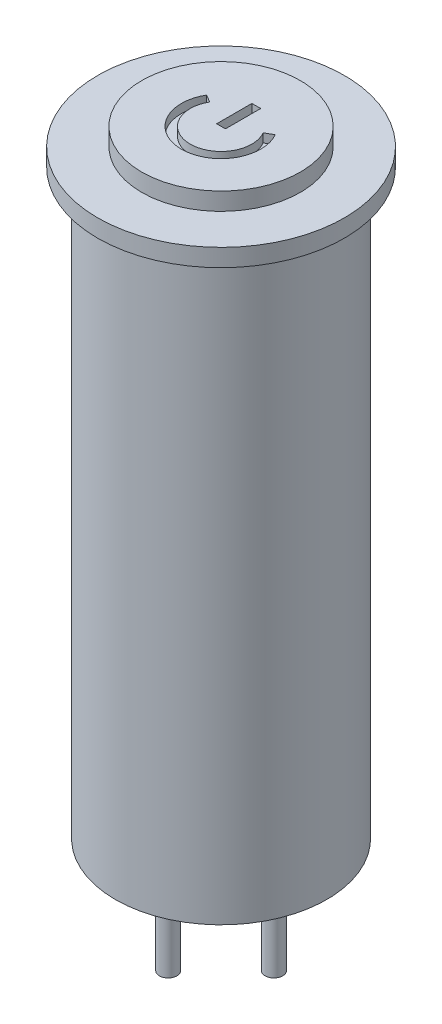
ISO-10303-21;
HEADER;
FILE_DESCRIPTION(('STEP AP214'),'2;1');
FILE_NAME('part.step','',(''),(''),'','','');
FILE_SCHEMA(('AUTOMOTIVE_DESIGN { 1 0 10303 214 1 1 1 1 }'));
ENDSEC;
DATA;
#1=APPLICATION_CONTEXT('core data for automotive mechanical design processes');
#2=APPLICATION_PROTOCOL_DEFINITION('international standard','automotive_design',2000,#1);
#3=PRODUCT_CONTEXT('',#1,'mechanical');
#4=PRODUCT('Part','Part','',(#3));
#5=PRODUCT_RELATED_PRODUCT_CATEGORY('part','',(#4));
#6=PRODUCT_DEFINITION_FORMATION('','',#4);
#7=PRODUCT_DEFINITION_CONTEXT('part definition',#1,'design');
#8=PRODUCT_DEFINITION('design','',#6,#7);
#9=PRODUCT_DEFINITION_SHAPE('','',#8);
#10=(LENGTH_UNIT() NAMED_UNIT(*) SI_UNIT(.MILLI.,.METRE.));
#11=(NAMED_UNIT(*) PLANE_ANGLE_UNIT() SI_UNIT($,.RADIAN.));
#12=(NAMED_UNIT(*) SI_UNIT($,.STERADIAN.) SOLID_ANGLE_UNIT());
#13=UNCERTAINTY_MEASURE_WITH_UNIT(LENGTH_MEASURE(1.E-05),#10,'distance_accuracy_value','');
#14=(GEOMETRIC_REPRESENTATION_CONTEXT(3) GLOBAL_UNCERTAINTY_ASSIGNED_CONTEXT((#13)) GLOBAL_UNIT_ASSIGNED_CONTEXT((#10,
#11,#12)) REPRESENTATION_CONTEXT('',''));
#15=CARTESIAN_POINT('',(0.,0.,0.));
#16=DIRECTION('',(0.,0.,1.));
#17=DIRECTION('',(1.,0.,0.));
#18=AXIS2_PLACEMENT_3D('',#15,#16,#17);
#19=CARTESIAN_POINT('',(0.,1.,0.));
#20=DIRECTION('',(0.,-1.,0.));
#21=DIRECTION('',(0.,0.,-1.));
#22=AXIS2_PLACEMENT_3D('',#19,#20,#21);
#23=CYLINDRICAL_SURFACE('',#22,7.);
#24=CARTESIAN_POINT('',(0.,1.,0.));
#25=DIRECTION('',(0.,1.,0.));
#26=DIRECTION('',(0.,0.,1.));
#27=AXIS2_PLACEMENT_3D('',#24,#25,#26);
#28=CIRCLE('',#27,7.);
#29=CARTESIAN_POINT('',(0.,1.,7.));
#30=VERTEX_POINT('',#29);
#31=EDGE_CURVE('E231',#30,#30,#28,.T.);
#32=ORIENTED_EDGE('',*,*,#31,.F.);
#33=EDGE_LOOP('',(#32));
#34=FACE_BOUND('',#33,.T.);
#35=CARTESIAN_POINT('',(0.,0.,0.));
#36=DIRECTION('',(0.,1.,0.));
#37=DIRECTION('',(0.,0.,1.));
#38=AXIS2_PLACEMENT_3D('',#35,#36,#37);
#39=CIRCLE('',#38,7.);
#40=CARTESIAN_POINT('',(0.,0.,7.));
#41=VERTEX_POINT('',#40);
#42=EDGE_CURVE('E70',#41,#41,#39,.T.);
#43=ORIENTED_EDGE('',*,*,#42,.T.);
#44=EDGE_LOOP('',(#43));
#45=FACE_BOUND('',#44,.T.);
#46=ADVANCED_FACE('F67',(#34,#45),#23,.T.);
#47=CARTESIAN_POINT('',(0.,1.,0.));
#48=DIRECTION('',(0.,1.,0.));
#49=DIRECTION('',(0.,0.,1.));
#50=AXIS2_PLACEMENT_3D('',#47,#48,#49);
#51=PLANE('',#50);
#52=CARTESIAN_POINT('',(0.,1.,0.));
#53=DIRECTION('',(0.,1.,0.));
#54=DIRECTION('',(0.,0.,1.));
#55=AXIS2_PLACEMENT_3D('',#52,#53,#54);
#56=CIRCLE('',#55,4.5);
#57=CARTESIAN_POINT('',(0.,1.,4.5));
#58=VERTEX_POINT('',#57);
#59=EDGE_CURVE('E76',#58,#58,#56,.T.);
#60=ORIENTED_EDGE('',*,*,#59,.F.);
#61=EDGE_LOOP('',(#60));
#62=FACE_BOUND('',#61,.T.);
#63=ORIENTED_EDGE('',*,*,#31,.T.);
#64=EDGE_LOOP('',(#63));
#65=FACE_BOUND('',#64,.T.);
#66=ADVANCED_FACE('F244',(#62,#65),#51,.T.);
#67=CARTESIAN_POINT('',(0.,0.,0.));
#68=DIRECTION('',(0.,1.,0.));
#69=DIRECTION('',(0.,0.,1.));
#70=AXIS2_PLACEMENT_3D('',#67,#68,#69);
#71=PLANE('',#70);
#72=CARTESIAN_POINT('',(0.,0.,0.));
#73=DIRECTION('',(0.,-1.,0.));
#74=DIRECTION('',(0.,0.,-1.));
#75=AXIS2_PLACEMENT_3D('',#72,#73,#74);
#76=CIRCLE('',#75,6.);
#77=CARTESIAN_POINT('',(0.,0.,-6.));
#78=VERTEX_POINT('',#77);
#79=EDGE_CURVE('E12',#78,#78,#76,.T.);
#80=ORIENTED_EDGE('',*,*,#79,.F.);
#81=EDGE_LOOP('',(#80));
#82=FACE_BOUND('',#81,.T.);
#83=ORIENTED_EDGE('',*,*,#42,.F.);
#84=EDGE_LOOP('',(#83));
#85=FACE_BOUND('',#84,.T.);
#86=ADVANCED_FACE('F241',(#82,#85),#71,.F.);
#87=CARTESIAN_POINT('',(0.,2.,0.));
#88=DIRECTION('',(0.,-1.,0.));
#89=DIRECTION('',(0.,0.,-1.));
#90=AXIS2_PLACEMENT_3D('',#87,#88,#89);
#91=CYLINDRICAL_SURFACE('',#90,4.5);
#92=CARTESIAN_POINT('',(0.,2.,0.));
#93=DIRECTION('',(0.,1.,0.));
#94=DIRECTION('',(0.,0.,1.));
#95=AXIS2_PLACEMENT_3D('',#92,#93,#94);
#96=CIRCLE('',#95,4.5);
#97=CARTESIAN_POINT('',(0.,2.,4.5));
#98=VERTEX_POINT('',#97);
#99=EDGE_CURVE('E217',#98,#98,#96,.T.);
#100=ORIENTED_EDGE('',*,*,#99,.F.);
#101=EDGE_LOOP('',(#100));
#102=FACE_BOUND('',#101,.T.);
#103=ORIENTED_EDGE('',*,*,#59,.T.);
#104=EDGE_LOOP('',(#103));
#105=FACE_BOUND('',#104,.T.);
#106=ADVANCED_FACE('F243',(#102,#105),#91,.T.);
#107=CARTESIAN_POINT('',(0.,2.,0.));
#108=DIRECTION('',(0.,1.,0.));
#109=DIRECTION('',(0.,0.,1.));
#110=AXIS2_PLACEMENT_3D('',#107,#108,#109);
#111=PLANE('',#110);
#112=CARTESIAN_POINT('',(0.,2.,0.));
#113=DIRECTION('',(0.,1.,0.));
#114=DIRECTION('',(1.,0.,0.));
#115=AXIS2_PLACEMENT_3D('',#112,#113,#114);
#116=CIRCLE('',#115,2.25);
#117=CARTESIAN_POINT('',(-1.94855715851499,2.,-1.125));
#118=VERTEX_POINT('',#117);
#119=CARTESIAN_POINT('',(1.94855715851499,2.,-1.125));
#120=VERTEX_POINT('',#119);
#121=EDGE_CURVE('E84',#118,#120,#116,.T.);
#122=ORIENTED_EDGE('',*,*,#121,.F.);
#123=DIRECTION('',(0.866025403784439,0.,0.499999999999999));
#124=VECTOR('',#123,1.);
#125=CARTESIAN_POINT('',(-1.94855715851499,2.,-1.125));
#126=LINE('',#125,#124);
#127=CARTESIAN_POINT('',(-1.51554445662277,2.,-0.874999999999999));
#128=VERTEX_POINT('',#127);
#129=EDGE_CURVE('E157',#118,#128,#126,.T.);
#130=ORIENTED_EDGE('',*,*,#129,.T.);
#131=CARTESIAN_POINT('',(0.,2.,0.));
#132=DIRECTION('',(0.,1.,0.));
#133=DIRECTION('',(1.,0.,0.));
#134=AXIS2_PLACEMENT_3D('',#131,#132,#133);
#135=CIRCLE('',#134,1.75);
#136=CARTESIAN_POINT('',(1.51554445662277,2.,-0.874999999999999));
#137=VERTEX_POINT('',#136);
#138=EDGE_CURVE('E161',#128,#137,#135,.T.);
#139=ORIENTED_EDGE('',*,*,#138,.T.);
#140=DIRECTION('',(0.866025403784439,0.,-0.5));
#141=VECTOR('',#140,1.);
#142=CARTESIAN_POINT('',(1.51554445662277,2.,-0.874999999999999));
#143=LINE('',#142,#141);
#144=EDGE_CURVE('E171',#137,#120,#143,.T.);
#145=ORIENTED_EDGE('',*,*,#144,.T.);
#146=EDGE_LOOP('',(#122,#130,#139,#145));
#147=FACE_BOUND('',#146,.T.);
#148=DIRECTION('',(0.,0.,-1.));
#149=VECTOR('',#148,1.);
#150=CARTESIAN_POINT('',(0.25,2.,0.));
#151=LINE('',#150,#149);
#152=CARTESIAN_POINT('',(0.25,2.,0.));
#153=VERTEX_POINT('',#152);
#154=CARTESIAN_POINT('',(0.25,2.,-2.));
#155=VERTEX_POINT('',#154);
#156=EDGE_CURVE('E92',#153,#155,#151,.T.);
#157=ORIENTED_EDGE('',*,*,#156,.F.);
#158=DIRECTION('',(-1.,0.,0.));
#159=VECTOR('',#158,1.);
#160=CARTESIAN_POINT('',(0.25,2.,0.));
#161=LINE('',#160,#159);
#162=CARTESIAN_POINT('',(-0.25,2.,0.));
#163=VERTEX_POINT('',#162);
#164=EDGE_CURVE('E191',#153,#163,#161,.T.);
#165=ORIENTED_EDGE('',*,*,#164,.T.);
#166=DIRECTION('',(0.,0.,-1.));
#167=VECTOR('',#166,1.);
#168=CARTESIAN_POINT('',(-0.25,2.,0.));
#169=LINE('',#168,#167);
#170=CARTESIAN_POINT('',(-0.25,2.,-2.));
#171=VERTEX_POINT('',#170);
#172=EDGE_CURVE('E207',#163,#171,#169,.T.);
#173=ORIENTED_EDGE('',*,*,#172,.T.);
#174=DIRECTION('',(1.,0.,0.));
#175=VECTOR('',#174,1.);
#176=CARTESIAN_POINT('',(-0.25,2.,-2.));
#177=LINE('',#176,#175);
#178=EDGE_CURVE('E203',#171,#155,#177,.T.);
#179=ORIENTED_EDGE('',*,*,#178,.T.);
#180=EDGE_LOOP('',(#157,#165,#173,#179));
#181=FACE_BOUND('',#180,.T.);
#182=ORIENTED_EDGE('',*,*,#99,.T.);
#183=EDGE_LOOP('',(#182));
#184=FACE_BOUND('',#183,.T.);
#185=ADVANCED_FACE('F250',(#147,#181,#184),#111,.T.);
#186=CARTESIAN_POINT('',(0.25,1.5,0.));
#187=DIRECTION('',(1.,0.,0.));
#188=DIRECTION('',(0.,0.,-1.));
#189=AXIS2_PLACEMENT_3D('',#186,#187,#188);
#190=PLANE('',#189);
#191=ORIENTED_EDGE('',*,*,#156,.T.);
#192=DIRECTION('',(0.,1.,0.));
#193=VECTOR('',#192,1.);
#194=CARTESIAN_POINT('',(0.25,1.5,-2.));
#195=LINE('',#194,#193);
#196=CARTESIAN_POINT('',(0.25,1.5,-2.));
#197=VERTEX_POINT('',#196);
#198=EDGE_CURVE('E200',#197,#155,#195,.T.);
#199=ORIENTED_EDGE('',*,*,#198,.F.);
#200=DIRECTION('',(0.,0.,-1.));
#201=VECTOR('',#200,1.);
#202=CARTESIAN_POINT('',(0.25,1.5,0.));
#203=LINE('',#202,#201);
#204=CARTESIAN_POINT('',(0.25,1.5,0.));
#205=VERTEX_POINT('',#204);
#206=EDGE_CURVE('E186',#205,#197,#203,.T.);
#207=ORIENTED_EDGE('',*,*,#206,.F.);
#208=DIRECTION('',(0.,1.,0.));
#209=VECTOR('',#208,1.);
#210=CARTESIAN_POINT('',(0.25,1.5,0.));
#211=LINE('',#210,#209);
#212=EDGE_CURVE('E214',#205,#153,#211,.T.);
#213=ORIENTED_EDGE('',*,*,#212,.T.);
#214=EDGE_LOOP('',(#191,#199,#207,#213));
#215=FACE_BOUND('',#214,.T.);
#216=ADVANCED_FACE('F282',(#215),#190,.F.);
#217=CARTESIAN_POINT('',(0.25,1.5,0.));
#218=DIRECTION('',(0.,0.,-1.));
#219=DIRECTION('',(-1.,0.,0.));
#220=AXIS2_PLACEMENT_3D('',#217,#218,#219);
#221=PLANE('',#220);
#222=ORIENTED_EDGE('',*,*,#164,.F.);
#223=ORIENTED_EDGE('',*,*,#212,.F.);
#224=DIRECTION('',(-1.,0.,0.));
#225=VECTOR('',#224,1.);
#226=CARTESIAN_POINT('',(0.25,1.5,0.));
#227=LINE('',#226,#225);
#228=CARTESIAN_POINT('',(-0.25,1.5,0.));
#229=VERTEX_POINT('',#228);
#230=EDGE_CURVE('E197',#205,#229,#227,.T.);
#231=ORIENTED_EDGE('',*,*,#230,.T.);
#232=DIRECTION('',(0.,1.,0.));
#233=VECTOR('',#232,1.);
#234=CARTESIAN_POINT('',(-0.25,1.5,0.));
#235=LINE('',#234,#233);
#236=EDGE_CURVE('E218',#229,#163,#235,.T.);
#237=ORIENTED_EDGE('',*,*,#236,.T.);
#238=EDGE_LOOP('',(#222,#223,#231,#237));
#239=FACE_BOUND('',#238,.T.);
#240=ADVANCED_FACE('F293',(#239),#221,.T.);
#241=CARTESIAN_POINT('',(-0.25,1.5,0.));
#242=DIRECTION('',(1.,0.,0.));
#243=DIRECTION('',(0.,0.,-1.));
#244=AXIS2_PLACEMENT_3D('',#241,#242,#243);
#245=PLANE('',#244);
#246=ORIENTED_EDGE('',*,*,#172,.F.);
#247=ORIENTED_EDGE('',*,*,#236,.F.);
#248=DIRECTION('',(0.,0.,-1.));
#249=VECTOR('',#248,1.);
#250=CARTESIAN_POINT('',(-0.25,1.5,0.));
#251=LINE('',#250,#249);
#252=CARTESIAN_POINT('',(-0.25,1.5,-2.));
#253=VERTEX_POINT('',#252);
#254=EDGE_CURVE('E194',#229,#253,#251,.T.);
#255=ORIENTED_EDGE('',*,*,#254,.T.);
#256=DIRECTION('',(0.,1.,0.));
#257=VECTOR('',#256,1.);
#258=CARTESIAN_POINT('',(-0.25,1.5,-2.));
#259=LINE('',#258,#257);
#260=EDGE_CURVE('E221',#253,#171,#259,.T.);
#261=ORIENTED_EDGE('',*,*,#260,.T.);
#262=EDGE_LOOP('',(#246,#247,#255,#261));
#263=FACE_BOUND('',#262,.T.);
#264=ADVANCED_FACE('F303',(#263),#245,.T.);
#265=CARTESIAN_POINT('',(-0.25,1.5,-2.));
#266=DIRECTION('',(0.,0.,1.));
#267=DIRECTION('',(1.,0.,0.));
#268=AXIS2_PLACEMENT_3D('',#265,#266,#267);
#269=PLANE('',#268);
#270=ORIENTED_EDGE('',*,*,#178,.F.);
#271=ORIENTED_EDGE('',*,*,#260,.F.);
#272=DIRECTION('',(1.,0.,0.));
#273=VECTOR('',#272,1.);
#274=CARTESIAN_POINT('',(-0.25,1.5,-2.));
#275=LINE('',#274,#273);
#276=EDGE_CURVE('E190',#253,#197,#275,.T.);
#277=ORIENTED_EDGE('',*,*,#276,.T.);
#278=ORIENTED_EDGE('',*,*,#198,.T.);
#279=EDGE_LOOP('',(#270,#271,#277,#278));
#280=FACE_BOUND('',#279,.T.);
#281=ADVANCED_FACE('F314',(#280),#269,.T.);
#282=CARTESIAN_POINT('',(0.,1.5,0.));
#283=DIRECTION('',(0.,-1.,0.));
#284=DIRECTION('',(-1.,0.,0.));
#285=AXIS2_PLACEMENT_3D('',#282,#283,#284);
#286=PLANE('',#285);
#287=ORIENTED_EDGE('',*,*,#206,.T.);
#288=ORIENTED_EDGE('',*,*,#276,.F.);
#289=ORIENTED_EDGE('',*,*,#254,.F.);
#290=ORIENTED_EDGE('',*,*,#230,.F.);
#291=EDGE_LOOP('',(#287,#288,#289,#290));
#292=FACE_BOUND('',#291,.T.);
#293=ADVANCED_FACE('F325',(#292),#286,.F.);
#294=CARTESIAN_POINT('',(0.,1.5,0.));
#295=DIRECTION('',(0.,1.,0.));
#296=DIRECTION('',(0.,0.,1.));
#297=AXIS2_PLACEMENT_3D('',#294,#295,#296);
#298=CYLINDRICAL_SURFACE('',#297,2.25);
#299=ORIENTED_EDGE('',*,*,#121,.T.);
#300=DIRECTION('',(0.,1.,0.));
#301=VECTOR('',#300,1.);
#302=CARTESIAN_POINT('',(1.94855715851499,1.5,-1.125));
#303=LINE('',#302,#301);
#304=CARTESIAN_POINT('',(1.94855715851499,1.5,-1.125));
#305=VERTEX_POINT('',#304);
#306=EDGE_CURVE('E139',#305,#120,#303,.T.);
#307=ORIENTED_EDGE('',*,*,#306,.F.);
#308=CARTESIAN_POINT('',(0.,1.5,0.));
#309=DIRECTION('',(0.,1.,0.));
#310=DIRECTION('',(1.,0.,0.));
#311=AXIS2_PLACEMENT_3D('',#308,#309,#310);
#312=CIRCLE('',#311,2.25);
#313=CARTESIAN_POINT('',(-1.94855715851499,1.5,-1.125));
#314=VERTEX_POINT('',#313);
#315=EDGE_CURVE('E147',#314,#305,#312,.T.);
#316=ORIENTED_EDGE('',*,*,#315,.F.);
#317=DIRECTION('',(0.,1.,0.));
#318=VECTOR('',#317,1.);
#319=CARTESIAN_POINT('',(-1.94855715851499,1.5,-1.125));
#320=LINE('',#319,#318);
#321=EDGE_CURVE('E178',#314,#118,#320,.T.);
#322=ORIENTED_EDGE('',*,*,#321,.T.);
#323=EDGE_LOOP('',(#299,#307,#316,#322));
#324=FACE_BOUND('',#323,.T.);
#325=ADVANCED_FACE('F150',(#324),#298,.F.);
#326=CARTESIAN_POINT('',(-1.94855715851499,1.5,-1.125));
#327=DIRECTION('',(-0.5,0.,0.866025403784439));
#328=DIRECTION('',(0.866025403784439,0.,0.499999999999999));
#329=AXIS2_PLACEMENT_3D('',#326,#327,#328);
#330=PLANE('',#329);
#331=ORIENTED_EDGE('',*,*,#129,.F.);
#332=ORIENTED_EDGE('',*,*,#321,.F.);
#333=DIRECTION('',(0.866025403784439,0.,0.499999999999999));
#334=VECTOR('',#333,1.);
#335=CARTESIAN_POINT('',(-1.94855715851499,1.5,-1.125));
#336=LINE('',#335,#334);
#337=CARTESIAN_POINT('',(-1.51554445662277,1.5,-0.874999999999999));
#338=VERTEX_POINT('',#337);
#339=EDGE_CURVE('E152',#314,#338,#336,.T.);
#340=ORIENTED_EDGE('',*,*,#339,.T.);
#341=DIRECTION('',(0.,1.,0.));
#342=VECTOR('',#341,1.);
#343=CARTESIAN_POINT('',(-1.51554445662277,1.5,-0.874999999999999));
#344=LINE('',#343,#342);
#345=EDGE_CURVE('E181',#338,#128,#344,.T.);
#346=ORIENTED_EDGE('',*,*,#345,.T.);
#347=EDGE_LOOP('',(#331,#332,#340,#346));
#348=FACE_BOUND('',#347,.T.);
#349=ADVANCED_FACE('F346',(#348),#330,.T.);
#350=CARTESIAN_POINT('',(0.,1.5,0.));
#351=DIRECTION('',(0.,1.,0.));
#352=DIRECTION('',(0.,0.,1.));
#353=AXIS2_PLACEMENT_3D('',#350,#351,#352);
#354=CYLINDRICAL_SURFACE('',#353,1.75);
#355=ORIENTED_EDGE('',*,*,#138,.F.);
#356=ORIENTED_EDGE('',*,*,#345,.F.);
#357=CARTESIAN_POINT('',(0.,1.5,0.));
#358=DIRECTION('',(0.,1.,0.));
#359=DIRECTION('',(1.,0.,0.));
#360=AXIS2_PLACEMENT_3D('',#357,#358,#359);
#361=CIRCLE('',#360,1.75);
#362=CARTESIAN_POINT('',(1.51554445662277,1.5,-0.874999999999999));
#363=VERTEX_POINT('',#362);
#364=EDGE_CURVE('E146',#338,#363,#361,.T.);
#365=ORIENTED_EDGE('',*,*,#364,.T.);
#366=DIRECTION('',(0.,1.,0.));
#367=VECTOR('',#366,1.);
#368=CARTESIAN_POINT('',(1.51554445662277,1.5,-0.874999999999999));
#369=LINE('',#368,#367);
#370=EDGE_CURVE('E141',#363,#137,#369,.T.);
#371=ORIENTED_EDGE('',*,*,#370,.T.);
#372=EDGE_LOOP('',(#355,#356,#365,#371));
#373=FACE_BOUND('',#372,.T.);
#374=ADVANCED_FACE('F356',(#373),#354,.T.);
#375=CARTESIAN_POINT('',(1.51554445662277,1.5,-0.874999999999999));
#376=DIRECTION('',(0.5,0.,0.866025403784439));
#377=DIRECTION('',(0.866025403784439,0.,-0.5));
#378=AXIS2_PLACEMENT_3D('',#375,#376,#377);
#379=PLANE('',#378);
#380=ORIENTED_EDGE('',*,*,#144,.F.);
#381=ORIENTED_EDGE('',*,*,#370,.F.);
#382=DIRECTION('',(0.866025403784439,0.,-0.5));
#383=VECTOR('',#382,1.);
#384=CARTESIAN_POINT('',(1.51554445662277,1.5,-0.874999999999999));
#385=LINE('',#384,#383);
#386=EDGE_CURVE('E136',#363,#305,#385,.T.);
#387=ORIENTED_EDGE('',*,*,#386,.T.);
#388=ORIENTED_EDGE('',*,*,#306,.T.);
#389=EDGE_LOOP('',(#380,#381,#387,#388));
#390=FACE_BOUND('',#389,.T.);
#391=ADVANCED_FACE('F138',(#390),#379,.T.);
#392=CARTESIAN_POINT('',(0.,1.5,0.));
#393=DIRECTION('',(0.,1.,0.));
#394=DIRECTION('',(1.,0.,0.));
#395=AXIS2_PLACEMENT_3D('',#392,#393,#394);
#396=PLANE('',#395);
#397=ORIENTED_EDGE('',*,*,#315,.T.);
#398=ORIENTED_EDGE('',*,*,#386,.F.);
#399=ORIENTED_EDGE('',*,*,#364,.F.);
#400=ORIENTED_EDGE('',*,*,#339,.F.);
#401=EDGE_LOOP('',(#397,#398,#399,#400));
#402=FACE_BOUND('',#401,.T.);
#403=ADVANCED_FACE('F155',(#402),#396,.T.);
#404=CARTESIAN_POINT('',(0.,-33.,0.));
#405=DIRECTION('',(0.,1.,0.));
#406=DIRECTION('',(0.,0.,1.));
#407=AXIS2_PLACEMENT_3D('',#404,#405,#406);
#408=CYLINDRICAL_SURFACE('',#407,6.);
#409=CARTESIAN_POINT('',(0.,-33.,0.));
#410=DIRECTION('',(0.,-1.,0.));
#411=DIRECTION('',(0.,0.,-1.));
#412=AXIS2_PLACEMENT_3D('',#409,#410,#411);
#413=CIRCLE('',#412,6.);
#414=CARTESIAN_POINT('',(0.,-33.,-6.));
#415=VERTEX_POINT('',#414);
#416=EDGE_CURVE('E172',#415,#415,#413,.T.);
#417=ORIENTED_EDGE('',*,*,#416,.F.);
#418=EDGE_LOOP('',(#417));
#419=FACE_BOUND('',#418,.T.);
#420=ORIENTED_EDGE('',*,*,#79,.T.);
#421=EDGE_LOOP('',(#420));
#422=FACE_BOUND('',#421,.T.);
#423=ADVANCED_FACE('F385',(#419,#422),#408,.T.);
#424=CARTESIAN_POINT('',(0.,-33.,0.));
#425=DIRECTION('',(0.,-1.,0.));
#426=DIRECTION('',(0.,0.,-1.));
#427=AXIS2_PLACEMENT_3D('',#424,#425,#426);
#428=PLANE('',#427);
#429=CARTESIAN_POINT('',(-2.99999999999992,-33.,0.));
#430=DIRECTION('',(0.,-1.,0.));
#431=DIRECTION('',(0.,0.,-1.));
#432=AXIS2_PLACEMENT_3D('',#429,#430,#431);
#433=CIRCLE('',#432,0.500000000000136);
#434=CARTESIAN_POINT('',(-2.99999999999992,-33.,-0.500000000000221));
#435=VERTEX_POINT('',#434);
#436=EDGE_CURVE('E536',#435,#435,#433,.T.);
#437=ORIENTED_EDGE('',*,*,#436,.F.);
#438=EDGE_LOOP('',(#437));
#439=FACE_BOUND('',#438,.T.);
#440=CARTESIAN_POINT('',(1.69428074463191E-13,-33.,-3.));
#441=DIRECTION('',(0.,-1.,0.));
#442=DIRECTION('',(0.,0.,-1.));
#443=AXIS2_PLACEMENT_3D('',#440,#441,#442);
#444=CIRCLE('',#443,0.500000000000182);
#445=CARTESIAN_POINT('',(1.69428074463191E-13,-33.,-3.50000000000018));
#446=VERTEX_POINT('',#445);
#447=EDGE_CURVE('E543',#446,#446,#444,.T.);
#448=ORIENTED_EDGE('',*,*,#447,.F.);
#449=EDGE_LOOP('',(#448));
#450=FACE_BOUND('',#449,.T.);
#451=CARTESIAN_POINT('',(3.00000000000008,-33.,0.));
#452=DIRECTION('',(0.,-1.,0.));
#453=DIRECTION('',(0.,0.,-1.));
#454=AXIS2_PLACEMENT_3D('',#451,#452,#453);
#455=CIRCLE('',#454,0.500000000000066);
#456=CARTESIAN_POINT('',(3.00000000000008,-33.,-0.499999999999982));
#457=VERTEX_POINT('',#456);
#458=EDGE_CURVE('E551',#457,#457,#455,.T.);
#459=ORIENTED_EDGE('',*,*,#458,.F.);
#460=EDGE_LOOP('',(#459));
#461=FACE_BOUND('',#460,.T.);
#462=CARTESIAN_POINT('',(0.,-33.,3.));
#463=DIRECTION('',(0.,-1.,0.));
#464=DIRECTION('',(0.,0.,-1.));
#465=AXIS2_PLACEMENT_3D('',#462,#463,#464);
#466=CIRCLE('',#465,0.5);
#467=CARTESIAN_POINT('',(0.,-33.,2.5));
#468=VERTEX_POINT('',#467);
#469=EDGE_CURVE('E555',#468,#468,#466,.T.);
#470=ORIENTED_EDGE('',*,*,#469,.F.);
#471=EDGE_LOOP('',(#470));
#472=FACE_BOUND('',#471,.T.);
#473=ORIENTED_EDGE('',*,*,#416,.T.);
#474=EDGE_LOOP('',(#473));
#475=FACE_BOUND('',#474,.T.);
#476=ADVANCED_FACE('F400',(#439,#450,#461,#472,#475),#428,.T.);
#477=CARTESIAN_POINT('',(0.,-38.,3.));
#478=DIRECTION('',(0.,1.,0.));
#479=DIRECTION('',(0.,0.,1.));
#480=AXIS2_PLACEMENT_3D('',#477,#478,#479);
#481=CYLINDRICAL_SURFACE('',#480,0.5);
#482=CARTESIAN_POINT('',(0.,-38.,3.));
#483=DIRECTION('',(0.,-1.,0.));
#484=DIRECTION('',(0.,0.,-1.));
#485=AXIS2_PLACEMENT_3D('',#482,#483,#484);
#486=CIRCLE('',#485,0.5);
#487=CARTESIAN_POINT('',(0.,-38.,2.5));
#488=VERTEX_POINT('',#487);
#489=EDGE_CURVE('E559',#488,#488,#486,.T.);
#490=ORIENTED_EDGE('',*,*,#489,.F.);
#491=EDGE_LOOP('',(#490));
#492=FACE_BOUND('',#491,.T.);
#493=ORIENTED_EDGE('',*,*,#469,.T.);
#494=EDGE_LOOP('',(#493));
#495=FACE_BOUND('',#494,.T.);
#496=ADVANCED_FACE('F411',(#492,#495),#481,.T.);
#497=CARTESIAN_POINT('',(0.,-38.,3.));
#498=DIRECTION('',(0.,-1.,0.));
#499=DIRECTION('',(0.,0.,-1.));
#500=AXIS2_PLACEMENT_3D('',#497,#498,#499);
#501=PLANE('',#500);
#502=ORIENTED_EDGE('',*,*,#489,.T.);
#503=EDGE_LOOP('',(#502));
#504=FACE_BOUND('',#503,.T.);
#505=ADVANCED_FACE('F422',(#504),#501,.T.);
#506=CARTESIAN_POINT('',(3.00000000000008,-38.,0.));
#507=DIRECTION('',(0.,1.,0.));
#508=DIRECTION('',(0.,0.,1.));
#509=AXIS2_PLACEMENT_3D('',#506,#507,#508);
#510=CYLINDRICAL_SURFACE('',#509,0.500000000000066);
#511=CARTESIAN_POINT('',(3.00000000000008,-38.,0.));
#512=DIRECTION('',(0.,-1.,0.));
#513=DIRECTION('',(0.,0.,-1.));
#514=AXIS2_PLACEMENT_3D('',#511,#512,#513);
#515=CIRCLE('',#514,0.500000000000066);
#516=CARTESIAN_POINT('',(3.00000000000008,-38.,-0.499999999999982));
#517=VERTEX_POINT('',#516);
#518=EDGE_CURVE('E547',#517,#517,#515,.T.);
#519=ORIENTED_EDGE('',*,*,#518,.F.);
#520=EDGE_LOOP('',(#519));
#521=FACE_BOUND('',#520,.T.);
#522=ORIENTED_EDGE('',*,*,#458,.T.);
#523=EDGE_LOOP('',(#522));
#524=FACE_BOUND('',#523,.T.);
#525=ADVANCED_FACE('F433',(#521,#524),#510,.T.);
#526=CARTESIAN_POINT('',(3.00000000000008,-38.,0.));
#527=DIRECTION('',(0.,-1.,0.));
#528=DIRECTION('',(0.,0.,-1.));
#529=AXIS2_PLACEMENT_3D('',#526,#527,#528);
#530=PLANE('',#529);
#531=ORIENTED_EDGE('',*,*,#518,.T.);
#532=EDGE_LOOP('',(#531));
#533=FACE_BOUND('',#532,.T.);
#534=ADVANCED_FACE('F444',(#533),#530,.T.);
#535=CARTESIAN_POINT('',(1.69428074463191E-13,-38.,-3.));
#536=DIRECTION('',(0.,1.,0.));
#537=DIRECTION('',(0.,0.,1.));
#538=AXIS2_PLACEMENT_3D('',#535,#536,#537);
#539=CYLINDRICAL_SURFACE('',#538,0.500000000000182);
#540=CARTESIAN_POINT('',(1.69428074463191E-13,-38.,-3.));
#541=DIRECTION('',(0.,-1.,0.));
#542=DIRECTION('',(0.,0.,-1.));
#543=AXIS2_PLACEMENT_3D('',#540,#541,#542);
#544=CIRCLE('',#543,0.500000000000182);
#545=CARTESIAN_POINT('',(1.69428074463191E-13,-38.,-3.50000000000018));
#546=VERTEX_POINT('',#545);
#547=EDGE_CURVE('E540',#546,#546,#544,.T.);
#548=ORIENTED_EDGE('',*,*,#547,.F.);
#549=EDGE_LOOP('',(#548));
#550=FACE_BOUND('',#549,.T.);
#551=ORIENTED_EDGE('',*,*,#447,.T.);
#552=EDGE_LOOP('',(#551));
#553=FACE_BOUND('',#552,.T.);
#554=ADVANCED_FACE('F455',(#550,#553),#539,.T.);
#555=CARTESIAN_POINT('',(1.69428074463191E-13,-38.,-3.));
#556=DIRECTION('',(0.,-1.,0.));
#557=DIRECTION('',(0.,0.,-1.));
#558=AXIS2_PLACEMENT_3D('',#555,#556,#557);
#559=PLANE('',#558);
#560=ORIENTED_EDGE('',*,*,#547,.T.);
#561=EDGE_LOOP('',(#560));
#562=FACE_BOUND('',#561,.T.);
#563=ADVANCED_FACE('F466',(#562),#559,.T.);
#564=CARTESIAN_POINT('',(-2.99999999999992,-38.,0.));
#565=DIRECTION('',(0.,1.,0.));
#566=DIRECTION('',(0.,0.,1.));
#567=AXIS2_PLACEMENT_3D('',#564,#565,#566);
#568=CYLINDRICAL_SURFACE('',#567,0.500000000000136);
#569=CARTESIAN_POINT('',(-2.99999999999992,-38.,0.));
#570=DIRECTION('',(0.,-1.,0.));
#571=DIRECTION('',(0.,0.,-1.));
#572=AXIS2_PLACEMENT_3D('',#569,#570,#571);
#573=CIRCLE('',#572,0.500000000000136);
#574=CARTESIAN_POINT('',(-2.99999999999992,-38.,-0.500000000000221));
#575=VERTEX_POINT('',#574);
#576=EDGE_CURVE('E534',#575,#575,#573,.T.);
#577=ORIENTED_EDGE('',*,*,#576,.F.);
#578=EDGE_LOOP('',(#577));
#579=FACE_BOUND('',#578,.T.);
#580=ORIENTED_EDGE('',*,*,#436,.T.);
#581=EDGE_LOOP('',(#580));
#582=FACE_BOUND('',#581,.T.);
#583=ADVANCED_FACE('F477',(#579,#582),#568,.T.);
#584=CARTESIAN_POINT('',(-2.99999999999992,-38.,0.));
#585=DIRECTION('',(0.,-1.,0.));
#586=DIRECTION('',(0.,0.,-1.));
#587=AXIS2_PLACEMENT_3D('',#584,#585,#586);
#588=PLANE('',#587);
#589=ORIENTED_EDGE('',*,*,#576,.T.);
#590=EDGE_LOOP('',(#589));
#591=FACE_BOUND('',#590,.T.);
#592=ADVANCED_FACE('F488',(#591),#588,.T.);
#593=CLOSED_SHELL('',(#46,#66,#86,#106,#185,#216,#240,#264,#281,#293,#325,#349,#374,#391,#403,
#423,#476,#496,#505,#525,#534,#554,#563,#583,#592));
#594=MANIFOLD_SOLID_BREP('B2',#593);
#595=ADVANCED_BREP_SHAPE_REPRESENTATION('',(#18,#594),#14);
#596=SHAPE_DEFINITION_REPRESENTATION(#9,#595);
ENDSEC;
END-ISO-10303-21;
